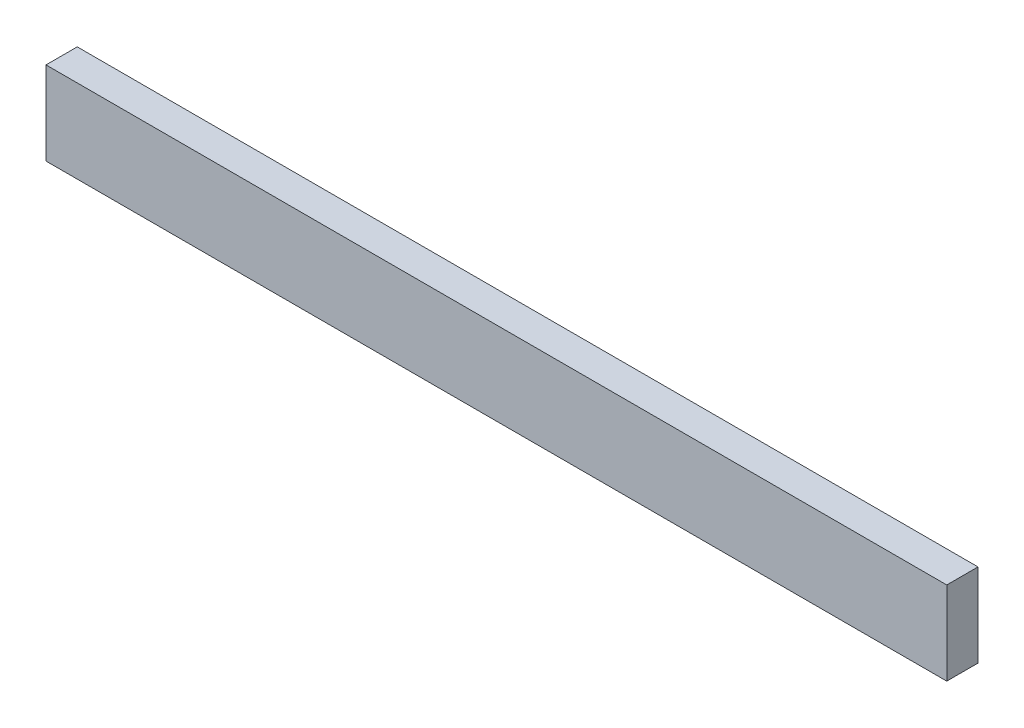
ISO-10303-21;
HEADER;
FILE_DESCRIPTION(('STEP AP214'),'2;1');
FILE_NAME('part.step','',(''),(''),'','','');
FILE_SCHEMA(('AUTOMOTIVE_DESIGN { 1 0 10303 214 1 1 1 1 }'));
ENDSEC;
DATA;
#1=APPLICATION_CONTEXT('core data for automotive mechanical design processes');
#2=APPLICATION_PROTOCOL_DEFINITION('international standard','automotive_design',2000,#1);
#3=PRODUCT_CONTEXT('',#1,'mechanical');
#4=PRODUCT('Part','Part','',(#3));
#5=PRODUCT_RELATED_PRODUCT_CATEGORY('part','',(#4));
#6=PRODUCT_DEFINITION_FORMATION('','',#4);
#7=PRODUCT_DEFINITION_CONTEXT('part definition',#1,'design');
#8=PRODUCT_DEFINITION('design','',#6,#7);
#9=PRODUCT_DEFINITION_SHAPE('','',#8);
#10=(LENGTH_UNIT() NAMED_UNIT(*) SI_UNIT(.MILLI.,.METRE.));
#11=(NAMED_UNIT(*) PLANE_ANGLE_UNIT() SI_UNIT($,.RADIAN.));
#12=(NAMED_UNIT(*) SI_UNIT($,.STERADIAN.) SOLID_ANGLE_UNIT());
#13=UNCERTAINTY_MEASURE_WITH_UNIT(LENGTH_MEASURE(1.E-05),#10,'distance_accuracy_value','');
#14=(GEOMETRIC_REPRESENTATION_CONTEXT(3) GLOBAL_UNCERTAINTY_ASSIGNED_CONTEXT((#13)) GLOBAL_UNIT_ASSIGNED_CONTEXT((#10,
#11,#12)) REPRESENTATION_CONTEXT('',''));
#15=CARTESIAN_POINT('',(0.,0.,0.));
#16=DIRECTION('',(0.,0.,1.));
#17=DIRECTION('',(1.,0.,0.));
#18=AXIS2_PLACEMENT_3D('',#15,#16,#17);
#19=CARTESIAN_POINT('',(-417.465319528975,-469.409867616982,15.));
#20=DIRECTION('',(1.,0.,0.));
#21=DIRECTION('',(0.,0.,-1.));
#22=AXIS2_PLACEMENT_3D('',#19,#20,#21);
#23=PLANE('',#22);
#24=DIRECTION('',(0.,-1.,0.));
#25=VECTOR('',#24,1.);
#26=CARTESIAN_POINT('',(-417.465319528975,-469.409867616982,0.));
#27=LINE('',#26,#25);
#28=CARTESIAN_POINT('',(-417.465319528975,-469.409867616982,0.));
#29=VERTEX_POINT('',#28);
#30=CARTESIAN_POINT('',(-417.465319528975,-509.409867616983,0.));
#31=VERTEX_POINT('',#30);
#32=EDGE_CURVE('E100',#29,#31,#27,.T.);
#33=ORIENTED_EDGE('',*,*,#32,.T.);
#34=DIRECTION('',(0.,0.,-1.));
#35=VECTOR('',#34,1.);
#36=CARTESIAN_POINT('',(-417.465319528975,-509.409867616983,15.));
#37=LINE('',#36,#35);
#38=CARTESIAN_POINT('',(-417.465319528975,-509.409867616983,15.));
#39=VERTEX_POINT('',#38);
#40=EDGE_CURVE('E11',#39,#31,#37,.T.);
#41=ORIENTED_EDGE('',*,*,#40,.F.);
#42=DIRECTION('',(0.,-1.,0.));
#43=VECTOR('',#42,1.);
#44=CARTESIAN_POINT('',(-417.465319528975,-469.409867616982,15.));
#45=LINE('',#44,#43);
#46=CARTESIAN_POINT('',(-417.465319528975,-469.409867616982,15.));
#47=VERTEX_POINT('',#46);
#48=EDGE_CURVE('E88',#47,#39,#45,.T.);
#49=ORIENTED_EDGE('',*,*,#48,.F.);
#50=DIRECTION('',(0.,0.,-1.));
#51=VECTOR('',#50,1.);
#52=CARTESIAN_POINT('',(-417.465319528975,-469.409867616982,15.));
#53=LINE('',#52,#51);
#54=EDGE_CURVE('E96',#47,#29,#53,.T.);
#55=ORIENTED_EDGE('',*,*,#54,.T.);
#56=EDGE_LOOP('',(#33,#41,#49,#55));
#57=FACE_BOUND('',#56,.T.);
#58=ADVANCED_FACE('F37',(#57),#23,.F.);
#59=CARTESIAN_POINT('',(-417.465319528975,-509.409867616983,15.));
#60=DIRECTION('',(0.,1.,0.));
#61=DIRECTION('',(0.,0.,1.));
#62=AXIS2_PLACEMENT_3D('',#59,#60,#61);
#63=PLANE('',#62);
#64=DIRECTION('',(1.,0.,0.));
#65=VECTOR('',#64,1.);
#66=CARTESIAN_POINT('',(-417.465319528975,-509.409867616983,0.));
#67=LINE('',#66,#65);
#68=CARTESIAN_POINT('',(14.9999999999999,-509.409867616983,0.));
#69=VERTEX_POINT('',#68);
#70=EDGE_CURVE('E92',#31,#69,#67,.T.);
#71=ORIENTED_EDGE('',*,*,#70,.T.);
#72=DIRECTION('',(0.,0.,-1.));
#73=VECTOR('',#72,1.);
#74=CARTESIAN_POINT('',(14.9999999999999,-509.409867616983,15.));
#75=LINE('',#74,#73);
#76=CARTESIAN_POINT('',(14.9999999999999,-509.409867616983,15.));
#77=VERTEX_POINT('',#76);
#78=EDGE_CURVE('E45',#77,#69,#75,.T.);
#79=ORIENTED_EDGE('',*,*,#78,.F.);
#80=DIRECTION('',(1.,0.,0.));
#81=VECTOR('',#80,1.);
#82=CARTESIAN_POINT('',(-417.465319528975,-509.409867616983,15.));
#83=LINE('',#82,#81);
#84=EDGE_CURVE('E83',#39,#77,#83,.T.);
#85=ORIENTED_EDGE('',*,*,#84,.F.);
#86=ORIENTED_EDGE('',*,*,#40,.T.);
#87=EDGE_LOOP('',(#71,#79,#85,#86));
#88=FACE_BOUND('',#87,.T.);
#89=ADVANCED_FACE('F91',(#88),#63,.F.);
#90=CARTESIAN_POINT('',(14.9999999999999,-469.409867616982,15.));
#91=DIRECTION('',(-1.,0.,0.));
#92=DIRECTION('',(0.,0.,1.));
#93=AXIS2_PLACEMENT_3D('',#90,#91,#92);
#94=PLANE('',#93);
#95=DIRECTION('',(0.,1.,0.));
#96=VECTOR('',#95,1.);
#97=CARTESIAN_POINT('',(14.9999999999999,-469.409867616982,0.));
#98=LINE('',#97,#96);
#99=CARTESIAN_POINT('',(14.9999999999999,-469.409867616982,0.));
#100=VERTEX_POINT('',#99);
#101=EDGE_CURVE('E70',#69,#100,#98,.T.);
#102=ORIENTED_EDGE('',*,*,#101,.T.);
#103=DIRECTION('',(0.,0.,-1.));
#104=VECTOR('',#103,1.);
#105=CARTESIAN_POINT('',(14.9999999999999,-469.409867616982,15.));
#106=LINE('',#105,#104);
#107=CARTESIAN_POINT('',(14.9999999999999,-469.409867616982,15.));
#108=VERTEX_POINT('',#107);
#109=EDGE_CURVE('E93',#108,#100,#106,.T.);
#110=ORIENTED_EDGE('',*,*,#109,.F.);
#111=DIRECTION('',(0.,1.,0.));
#112=VECTOR('',#111,1.);
#113=CARTESIAN_POINT('',(14.9999999999999,-469.409867616982,15.));
#114=LINE('',#113,#112);
#115=EDGE_CURVE('E86',#77,#108,#114,.T.);
#116=ORIENTED_EDGE('',*,*,#115,.F.);
#117=ORIENTED_EDGE('',*,*,#78,.T.);
#118=EDGE_LOOP('',(#102,#110,#116,#117));
#119=FACE_BOUND('',#118,.T.);
#120=ADVANCED_FACE('F94',(#119),#94,.F.);
#121=CARTESIAN_POINT('',(-417.465319528975,-469.409867616982,15.));
#122=DIRECTION('',(0.,-1.,0.));
#123=DIRECTION('',(0.,0.,-1.));
#124=AXIS2_PLACEMENT_3D('',#121,#122,#123);
#125=PLANE('',#124);
#126=DIRECTION('',(-1.,0.,0.));
#127=VECTOR('',#126,1.);
#128=CARTESIAN_POINT('',(-417.465319528975,-469.409867616982,0.));
#129=LINE('',#128,#127);
#130=EDGE_CURVE('E76',#100,#29,#129,.T.);
#131=ORIENTED_EDGE('',*,*,#130,.T.);
#132=ORIENTED_EDGE('',*,*,#54,.F.);
#133=DIRECTION('',(-1.,0.,0.));
#134=VECTOR('',#133,1.);
#135=CARTESIAN_POINT('',(-417.465319528975,-469.409867616982,15.));
#136=LINE('',#135,#134);
#137=EDGE_CURVE('E53',#108,#47,#136,.T.);
#138=ORIENTED_EDGE('',*,*,#137,.F.);
#139=ORIENTED_EDGE('',*,*,#109,.T.);
#140=EDGE_LOOP('',(#131,#132,#138,#139));
#141=FACE_BOUND('',#140,.T.);
#142=ADVANCED_FACE('F107',(#141),#125,.F.);
#143=CARTESIAN_POINT('',(0.,0.,15.));
#144=DIRECTION('',(0.,0.,1.));
#145=DIRECTION('',(1.,0.,0.));
#146=AXIS2_PLACEMENT_3D('',#143,#144,#145);
#147=PLANE('',#146);
#148=ORIENTED_EDGE('',*,*,#48,.T.);
#149=ORIENTED_EDGE('',*,*,#84,.T.);
#150=ORIENTED_EDGE('',*,*,#115,.T.);
#151=ORIENTED_EDGE('',*,*,#137,.T.);
#152=EDGE_LOOP('',(#148,#149,#150,#151));
#153=FACE_BOUND('',#152,.T.);
#154=ADVANCED_FACE('F84',(#153),#147,.T.);
#155=CARTESIAN_POINT('',(0.,0.,0.));
#156=DIRECTION('',(0.,0.,1.));
#157=DIRECTION('',(1.,0.,0.));
#158=AXIS2_PLACEMENT_3D('',#155,#156,#157);
#159=PLANE('',#158);
#160=ORIENTED_EDGE('',*,*,#32,.F.);
#161=ORIENTED_EDGE('',*,*,#130,.F.);
#162=ORIENTED_EDGE('',*,*,#101,.F.);
#163=ORIENTED_EDGE('',*,*,#70,.F.);
#164=EDGE_LOOP('',(#160,#161,#162,#163));
#165=FACE_BOUND('',#164,.T.);
#166=ADVANCED_FACE('F110',(#165),#159,.F.);
#167=CLOSED_SHELL('',(#58,#89,#120,#142,#154,#166));
#168=MANIFOLD_SOLID_BREP('B2',#167);
#169=ADVANCED_BREP_SHAPE_REPRESENTATION('',(#18,#168),#14);
#170=SHAPE_DEFINITION_REPRESENTATION(#9,#169);
ENDSEC;
END-ISO-10303-21;
